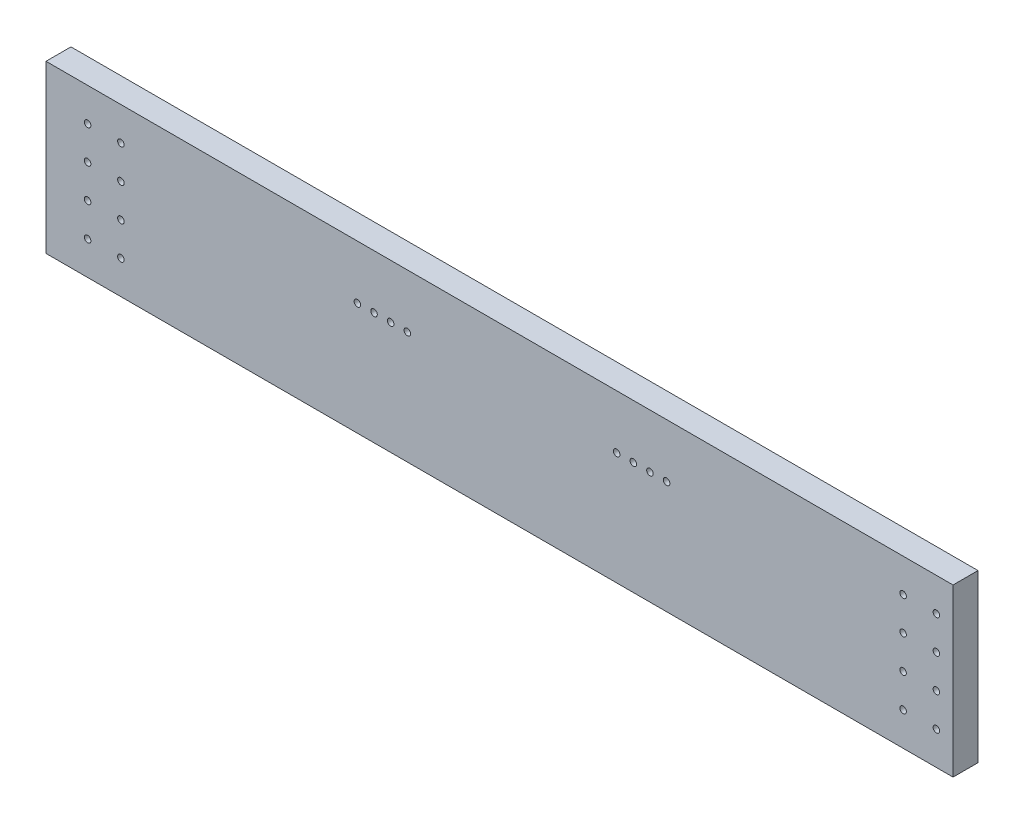
ISO-10303-21;
HEADER;
FILE_DESCRIPTION(('STEP AP214'),'2;1');
FILE_NAME('part.step','',(''),(''),'','','');
FILE_SCHEMA(('AUTOMOTIVE_DESIGN { 1 0 10303 214 1 1 1 1 }'));
ENDSEC;
DATA;
#1=APPLICATION_CONTEXT('core data for automotive mechanical design processes');
#2=APPLICATION_PROTOCOL_DEFINITION('international standard','automotive_design',2000,#1);
#3=PRODUCT_CONTEXT('',#1,'mechanical');
#4=PRODUCT('Part','Part','',(#3));
#5=PRODUCT_RELATED_PRODUCT_CATEGORY('part','',(#4));
#6=PRODUCT_DEFINITION_FORMATION('','',#4);
#7=PRODUCT_DEFINITION_CONTEXT('part definition',#1,'design');
#8=PRODUCT_DEFINITION('design','',#6,#7);
#9=PRODUCT_DEFINITION_SHAPE('','',#8);
#10=(LENGTH_UNIT() NAMED_UNIT(*) SI_UNIT(.MILLI.,.METRE.));
#11=(NAMED_UNIT(*) PLANE_ANGLE_UNIT() SI_UNIT($,.RADIAN.));
#12=(NAMED_UNIT(*) SI_UNIT($,.STERADIAN.) SOLID_ANGLE_UNIT());
#13=UNCERTAINTY_MEASURE_WITH_UNIT(LENGTH_MEASURE(1.E-05),#10,'distance_accuracy_value','');
#14=(GEOMETRIC_REPRESENTATION_CONTEXT(3) GLOBAL_UNCERTAINTY_ASSIGNED_CONTEXT((#13)) GLOBAL_UNIT_ASSIGNED_CONTEXT((#10,
#11,#12)) REPRESENTATION_CONTEXT('',''));
#15=CARTESIAN_POINT('',(0.,0.,0.));
#16=DIRECTION('',(0.,0.,1.));
#17=DIRECTION('',(1.,0.,0.));
#18=AXIS2_PLACEMENT_3D('',#15,#16,#17);
#19=CARTESIAN_POINT('',(31.75,38.1,6.35));
#20=DIRECTION('',(0.,0.,1.));
#21=DIRECTION('',(1.,0.,0.));
#22=AXIS2_PLACEMENT_3D('',#19,#20,#21);
#23=CYLINDRICAL_SURFACE('',#22,2.4892);
#24=CARTESIAN_POINT('',(31.75,38.1,6.35));
#25=DIRECTION('',(0.,0.,1.));
#26=DIRECTION('',(1.,0.,0.));
#27=AXIS2_PLACEMENT_3D('',#24,#25,#26);
#28=CIRCLE('',#27,2.4892);
#29=CARTESIAN_POINT('',(34.2392,38.1,6.35));
#30=VERTEX_POINT('',#29);
#31=EDGE_CURVE('E51',#30,#30,#28,.T.);
#32=ORIENTED_EDGE('',*,*,#31,.F.);
#33=EDGE_LOOP('',(#32));
#34=FACE_BOUND('',#33,.T.);
#35=CARTESIAN_POINT('',(31.75,38.1,25.4));
#36=DIRECTION('',(0.,0.,1.));
#37=DIRECTION('',(1.,0.,0.));
#38=AXIS2_PLACEMENT_3D('',#35,#36,#37);
#39=CIRCLE('',#38,2.4892);
#40=CARTESIAN_POINT('',(34.2392,38.1,25.4));
#41=VERTEX_POINT('',#40);
#42=EDGE_CURVE('E11',#41,#41,#39,.T.);
#43=ORIENTED_EDGE('',*,*,#42,.T.);
#44=EDGE_LOOP('',(#43));
#45=FACE_BOUND('',#44,.T.);
#46=ADVANCED_FACE('F42',(#34,#45),#23,.F.);
#47=CARTESIAN_POINT('',(31.75,12.7,6.35));
#48=DIRECTION('',(0.,0.,1.));
#49=DIRECTION('',(1.,0.,0.));
#50=AXIS2_PLACEMENT_3D('',#47,#48,#49);
#51=CYLINDRICAL_SURFACE('',#50,2.4892);
#52=CARTESIAN_POINT('',(31.75,12.7,6.35));
#53=DIRECTION('',(0.,0.,1.));
#54=DIRECTION('',(1.,0.,0.));
#55=AXIS2_PLACEMENT_3D('',#52,#53,#54);
#56=CIRCLE('',#55,2.4892);
#57=CARTESIAN_POINT('',(34.2392,12.7,6.35));
#58=VERTEX_POINT('',#57);
#59=EDGE_CURVE('E149',#58,#58,#56,.T.);
#60=ORIENTED_EDGE('',*,*,#59,.F.);
#61=EDGE_LOOP('',(#60));
#62=FACE_BOUND('',#61,.T.);
#63=CARTESIAN_POINT('',(31.75,12.7,25.4));
#64=DIRECTION('',(0.,0.,1.));
#65=DIRECTION('',(1.,0.,0.));
#66=AXIS2_PLACEMENT_3D('',#63,#64,#65);
#67=CIRCLE('',#66,2.4892);
#68=CARTESIAN_POINT('',(34.2392,12.7,25.4));
#69=VERTEX_POINT('',#68);
#70=EDGE_CURVE('E153',#69,#69,#67,.T.);
#71=ORIENTED_EDGE('',*,*,#70,.T.);
#72=EDGE_LOOP('',(#71));
#73=FACE_BOUND('',#72,.T.);
#74=ADVANCED_FACE('F165',(#62,#73),#51,.F.);
#75=CARTESIAN_POINT('',(6.35,38.1,6.35));
#76=DIRECTION('',(0.,0.,1.));
#77=DIRECTION('',(1.,0.,0.));
#78=AXIS2_PLACEMENT_3D('',#75,#76,#77);
#79=CYLINDRICAL_SURFACE('',#78,2.4892);
#80=CARTESIAN_POINT('',(6.35,38.1,6.35));
#81=DIRECTION('',(0.,0.,1.));
#82=DIRECTION('',(1.,0.,0.));
#83=AXIS2_PLACEMENT_3D('',#80,#81,#82);
#84=CIRCLE('',#83,2.4892);
#85=CARTESIAN_POINT('',(8.8392,38.1,6.35));
#86=VERTEX_POINT('',#85);
#87=EDGE_CURVE('E141',#86,#86,#84,.T.);
#88=ORIENTED_EDGE('',*,*,#87,.F.);
#89=EDGE_LOOP('',(#88));
#90=FACE_BOUND('',#89,.T.);
#91=CARTESIAN_POINT('',(6.35,38.1,25.4));
#92=DIRECTION('',(0.,0.,1.));
#93=DIRECTION('',(1.,0.,0.));
#94=AXIS2_PLACEMENT_3D('',#91,#92,#93);
#95=CIRCLE('',#94,2.4892);
#96=CARTESIAN_POINT('',(8.8392,38.1,25.4));
#97=VERTEX_POINT('',#96);
#98=EDGE_CURVE('E145',#97,#97,#95,.T.);
#99=ORIENTED_EDGE('',*,*,#98,.T.);
#100=EDGE_LOOP('',(#99));
#101=FACE_BOUND('',#100,.T.);
#102=ADVANCED_FACE('F186',(#90,#101),#79,.F.);
#103=CARTESIAN_POINT('',(6.35,12.7,6.35));
#104=DIRECTION('',(0.,0.,1.));
#105=DIRECTION('',(1.,0.,0.));
#106=AXIS2_PLACEMENT_3D('',#103,#104,#105);
#107=CYLINDRICAL_SURFACE('',#106,2.4892);
#108=CARTESIAN_POINT('',(6.35,12.7,6.35));
#109=DIRECTION('',(0.,0.,1.));
#110=DIRECTION('',(1.,0.,0.));
#111=AXIS2_PLACEMENT_3D('',#108,#109,#110);
#112=CIRCLE('',#111,2.4892);
#113=CARTESIAN_POINT('',(8.8392,12.7,6.35));
#114=VERTEX_POINT('',#113);
#115=EDGE_CURVE('E133',#114,#114,#112,.T.);
#116=ORIENTED_EDGE('',*,*,#115,.F.);
#117=EDGE_LOOP('',(#116));
#118=FACE_BOUND('',#117,.T.);
#119=CARTESIAN_POINT('',(6.35,12.7,25.4));
#120=DIRECTION('',(0.,0.,1.));
#121=DIRECTION('',(1.,0.,0.));
#122=AXIS2_PLACEMENT_3D('',#119,#120,#121);
#123=CIRCLE('',#122,2.4892);
#124=CARTESIAN_POINT('',(8.8392,12.7,25.4));
#125=VERTEX_POINT('',#124);
#126=EDGE_CURVE('E137',#125,#125,#123,.T.);
#127=ORIENTED_EDGE('',*,*,#126,.T.);
#128=EDGE_LOOP('',(#127));
#129=FACE_BOUND('',#128,.T.);
#130=ADVANCED_FACE('F177',(#118,#129),#107,.F.);
#131=CARTESIAN_POINT('',(-25.4,63.5,25.4));
#132=DIRECTION('',(1.,0.,0.));
#133=DIRECTION('',(0.,0.,-1.));
#134=AXIS2_PLACEMENT_3D('',#131,#132,#133);
#135=PLANE('',#134);
#136=DIRECTION('',(0.,0.,1.));
#137=VECTOR('',#136,1.);
#138=CARTESIAN_POINT('',(-25.4,-63.5,25.4));
#139=LINE('',#138,#137);
#140=CARTESIAN_POINT('',(-25.4,-63.5,6.35));
#141=VERTEX_POINT('',#140);
#142=CARTESIAN_POINT('',(-25.4,-63.5,25.4));
#143=VERTEX_POINT('',#142);
#144=EDGE_CURVE('E116',#141,#143,#139,.T.);
#145=ORIENTED_EDGE('',*,*,#144,.T.);
#146=DIRECTION('',(0.,-1.,0.));
#147=VECTOR('',#146,1.);
#148=CARTESIAN_POINT('',(-25.4,63.5,25.4));
#149=LINE('',#148,#147);
#150=CARTESIAN_POINT('',(-25.4,63.5,25.4));
#151=VERTEX_POINT('',#150);
#152=EDGE_CURVE('E104',#151,#143,#149,.T.);
#153=ORIENTED_EDGE('',*,*,#152,.F.);
#154=DIRECTION('',(0.,0.,1.));
#155=VECTOR('',#154,1.);
#156=CARTESIAN_POINT('',(-25.4,63.5,25.4));
#157=LINE('',#156,#155);
#158=CARTESIAN_POINT('',(-25.4,63.5,6.35));
#159=VERTEX_POINT('',#158);
#160=EDGE_CURVE('E95',#159,#151,#157,.T.);
#161=ORIENTED_EDGE('',*,*,#160,.F.);
#162=DIRECTION('',(0.,-1.,0.));
#163=VECTOR('',#162,1.);
#164=CARTESIAN_POINT('',(-25.4,63.5,6.35));
#165=LINE('',#164,#163);
#166=EDGE_CURVE('E112',#159,#141,#165,.T.);
#167=ORIENTED_EDGE('',*,*,#166,.T.);
#168=EDGE_LOOP('',(#145,#153,#161,#167));
#169=FACE_BOUND('',#168,.T.);
#170=ADVANCED_FACE('F169',(#169),#135,.F.);
#171=CARTESIAN_POINT('',(-25.4,63.5,25.4));
#172=DIRECTION('',(0.,0.,-1.));
#173=DIRECTION('',(-1.,0.,0.));
#174=AXIS2_PLACEMENT_3D('',#171,#172,#173);
#175=PLANE('',#174);
#176=CARTESIAN_POINT('',(448.183,22.479,25.4));
#177=DIRECTION('',(0.,0.,-1.));
#178=DIRECTION('',(-1.,0.,0.));
#179=AXIS2_PLACEMENT_3D('',#176,#177,#178);
#180=CIRCLE('',#179,2.4892);
#181=CARTESIAN_POINT('',(445.6938,22.479,25.4));
#182=VERTEX_POINT('',#181);
#183=EDGE_CURVE('E297',#182,#182,#180,.T.);
#184=ORIENTED_EDGE('',*,*,#183,.T.);
#185=EDGE_LOOP('',(#184));
#186=FACE_BOUND('',#185,.T.);
#187=CARTESIAN_POINT('',(435.483,22.479,25.4));
#188=DIRECTION('',(0.,0.,-1.));
#189=DIRECTION('',(-1.,0.,0.));
#190=AXIS2_PLACEMENT_3D('',#187,#188,#189);
#191=CIRCLE('',#190,2.4892);
#192=CARTESIAN_POINT('',(432.9938,22.479,25.4));
#193=VERTEX_POINT('',#192);
#194=EDGE_CURVE('E307',#193,#193,#191,.T.);
#195=ORIENTED_EDGE('',*,*,#194,.T.);
#196=EDGE_LOOP('',(#195));
#197=FACE_BOUND('',#196,.T.);
#198=CARTESIAN_POINT('',(422.783,22.479,25.4));
#199=DIRECTION('',(0.,0.,-1.));
#200=DIRECTION('',(-1.,0.,0.));
#201=AXIS2_PLACEMENT_3D('',#198,#199,#200);
#202=CIRCLE('',#201,2.4892);
#203=CARTESIAN_POINT('',(420.2938,22.479,25.4));
#204=VERTEX_POINT('',#203);
#205=EDGE_CURVE('E317',#204,#204,#202,.T.);
#206=ORIENTED_EDGE('',*,*,#205,.T.);
#207=EDGE_LOOP('',(#206));
#208=FACE_BOUND('',#207,.T.);
#209=CARTESIAN_POINT('',(410.083,22.479,25.4));
#210=DIRECTION('',(0.,0.,-1.));
#211=DIRECTION('',(-1.,0.,0.));
#212=AXIS2_PLACEMENT_3D('',#209,#210,#211);
#213=CIRCLE('',#212,2.48920000000001);
#214=CARTESIAN_POINT('',(407.5938,22.479,25.4));
#215=VERTEX_POINT('',#214);
#216=EDGE_CURVE('E325',#215,#215,#213,.T.);
#217=ORIENTED_EDGE('',*,*,#216,.T.);
#218=EDGE_LOOP('',(#217));
#219=FACE_BOUND('',#218,.T.);
#220=CARTESIAN_POINT('',(654.05,38.1,25.4));
#221=DIRECTION('',(0.,0.,-1.));
#222=DIRECTION('',(-1.,0.,0.));
#223=AXIS2_PLACEMENT_3D('',#220,#221,#222);
#224=CIRCLE('',#223,2.4892);
#225=CARTESIAN_POINT('',(651.5608,38.1,25.4));
#226=VERTEX_POINT('',#225);
#227=EDGE_CURVE('E333',#226,#226,#224,.T.);
#228=ORIENTED_EDGE('',*,*,#227,.T.);
#229=EDGE_LOOP('',(#228));
#230=FACE_BOUND('',#229,.T.);
#231=CARTESIAN_POINT('',(628.65,12.7,25.4));
#232=DIRECTION('',(0.,0.,-1.));
#233=DIRECTION('',(-1.,0.,0.));
#234=AXIS2_PLACEMENT_3D('',#231,#232,#233);
#235=CIRCLE('',#234,2.4892);
#236=CARTESIAN_POINT('',(626.1608,12.7,25.4));
#237=VERTEX_POINT('',#236);
#238=EDGE_CURVE('E342',#237,#237,#235,.T.);
#239=ORIENTED_EDGE('',*,*,#238,.T.);
#240=EDGE_LOOP('',(#239));
#241=FACE_BOUND('',#240,.T.);
#242=CARTESIAN_POINT('',(654.05,12.7,25.4));
#243=DIRECTION('',(0.,0.,-1.));
#244=DIRECTION('',(-1.,0.,0.));
#245=AXIS2_PLACEMENT_3D('',#242,#243,#244);
#246=CIRCLE('',#245,2.4892);
#247=CARTESIAN_POINT('',(651.5608,12.7,25.4));
#248=VERTEX_POINT('',#247);
#249=EDGE_CURVE('E341',#248,#248,#246,.T.);
#250=ORIENTED_EDGE('',*,*,#249,.T.);
#251=EDGE_LOOP('',(#250));
#252=FACE_BOUND('',#251,.T.);
#253=CARTESIAN_POINT('',(628.65,-12.7,25.4));
#254=DIRECTION('',(0.,0.,-1.));
#255=DIRECTION('',(-1.,0.,0.));
#256=AXIS2_PLACEMENT_3D('',#253,#254,#255);
#257=CIRCLE('',#256,2.4892);
#258=CARTESIAN_POINT('',(626.1608,-12.7,25.4));
#259=VERTEX_POINT('',#258);
#260=EDGE_CURVE('E358',#259,#259,#257,.T.);
#261=ORIENTED_EDGE('',*,*,#260,.T.);
#262=EDGE_LOOP('',(#261));
#263=FACE_BOUND('',#262,.T.);
#264=CARTESIAN_POINT('',(628.65,38.1,25.4));
#265=DIRECTION('',(0.,0.,-1.));
#266=DIRECTION('',(-1.,0.,0.));
#267=AXIS2_PLACEMENT_3D('',#264,#265,#266);
#268=CIRCLE('',#267,2.4892);
#269=CARTESIAN_POINT('',(626.1608,38.1,25.4));
#270=VERTEX_POINT('',#269);
#271=EDGE_CURVE('E304',#270,#270,#268,.T.);
#272=ORIENTED_EDGE('',*,*,#271,.T.);
#273=EDGE_LOOP('',(#272));
#274=FACE_BOUND('',#273,.T.);
#275=CARTESIAN_POINT('',(654.05,-12.7,25.4));
#276=DIRECTION('',(0.,0.,-1.));
#277=DIRECTION('',(-1.,0.,0.));
#278=AXIS2_PLACEMENT_3D('',#275,#276,#277);
#279=CIRCLE('',#278,2.4892);
#280=CARTESIAN_POINT('',(651.5608,-12.7,25.4));
#281=VERTEX_POINT('',#280);
#282=EDGE_CURVE('E357',#281,#281,#279,.T.);
#283=ORIENTED_EDGE('',*,*,#282,.T.);
#284=EDGE_LOOP('',(#283));
#285=FACE_BOUND('',#284,.T.);
#286=CARTESIAN_POINT('',(654.05,-38.1,25.4));
#287=DIRECTION('',(0.,0.,-1.));
#288=DIRECTION('',(-1.,0.,0.));
#289=AXIS2_PLACEMENT_3D('',#286,#287,#288);
#290=CIRCLE('',#289,2.4892);
#291=CARTESIAN_POINT('',(651.5608,-38.1,25.4));
#292=VERTEX_POINT('',#291);
#293=EDGE_CURVE('E382',#292,#292,#290,.T.);
#294=ORIENTED_EDGE('',*,*,#293,.T.);
#295=EDGE_LOOP('',(#294));
#296=FACE_BOUND('',#295,.T.);
#297=CARTESIAN_POINT('',(628.65,-38.1,25.4));
#298=DIRECTION('',(0.,0.,-1.));
#299=DIRECTION('',(-1.,0.,0.));
#300=AXIS2_PLACEMENT_3D('',#297,#298,#299);
#301=CIRCLE('',#300,2.4892);
#302=CARTESIAN_POINT('',(626.1608,-38.1,25.4));
#303=VERTEX_POINT('',#302);
#304=EDGE_CURVE('E373',#303,#303,#301,.T.);
#305=ORIENTED_EDGE('',*,*,#304,.T.);
#306=EDGE_LOOP('',(#305));
#307=FACE_BOUND('',#306,.T.);
#308=CARTESIAN_POINT('',(212.217,22.479,25.4));
#309=DIRECTION('',(0.,0.,1.));
#310=DIRECTION('',(1.,0.,0.));
#311=AXIS2_PLACEMENT_3D('',#308,#309,#310);
#312=CIRCLE('',#311,2.4892);
#313=CARTESIAN_POINT('',(214.7062,22.479,25.4));
#314=VERTEX_POINT('',#313);
#315=EDGE_CURVE('E398',#314,#314,#312,.T.);
#316=ORIENTED_EDGE('',*,*,#315,.F.);
#317=EDGE_LOOP('',(#316));
#318=FACE_BOUND('',#317,.T.);
#319=CARTESIAN_POINT('',(224.917,22.479,25.4));
#320=DIRECTION('',(0.,0.,1.));
#321=DIRECTION('',(1.,0.,0.));
#322=AXIS2_PLACEMENT_3D('',#319,#320,#321);
#323=CIRCLE('',#322,2.4892);
#324=CARTESIAN_POINT('',(227.4062,22.479,25.4));
#325=VERTEX_POINT('',#324);
#326=EDGE_CURVE('E402',#325,#325,#323,.T.);
#327=ORIENTED_EDGE('',*,*,#326,.F.);
#328=EDGE_LOOP('',(#327));
#329=FACE_BOUND('',#328,.T.);
#330=CARTESIAN_POINT('',(237.617,22.479,25.4));
#331=DIRECTION('',(0.,0.,1.));
#332=DIRECTION('',(1.,0.,0.));
#333=AXIS2_PLACEMENT_3D('',#330,#331,#332);
#334=CIRCLE('',#333,2.4892);
#335=CARTESIAN_POINT('',(240.1062,22.479,25.4));
#336=VERTEX_POINT('',#335);
#337=EDGE_CURVE('E410',#336,#336,#334,.T.);
#338=ORIENTED_EDGE('',*,*,#337,.F.);
#339=EDGE_LOOP('',(#338));
#340=FACE_BOUND('',#339,.T.);
#341=CARTESIAN_POINT('',(250.317,22.479,25.4));
#342=DIRECTION('',(0.,0.,1.));
#343=DIRECTION('',(1.,0.,0.));
#344=AXIS2_PLACEMENT_3D('',#341,#342,#343);
#345=CIRCLE('',#344,2.48920000000001);
#346=CARTESIAN_POINT('',(252.8062,22.479,25.4));
#347=VERTEX_POINT('',#346);
#348=EDGE_CURVE('E418',#347,#347,#345,.T.);
#349=ORIENTED_EDGE('',*,*,#348,.F.);
#350=EDGE_LOOP('',(#349));
#351=FACE_BOUND('',#350,.T.);
#352=CARTESIAN_POINT('',(31.75,-12.7,25.4));
#353=DIRECTION('',(0.,0.,1.));
#354=DIRECTION('',(1.,0.,0.));
#355=AXIS2_PLACEMENT_3D('',#352,#353,#354);
#356=CIRCLE('',#355,2.4892);
#357=CARTESIAN_POINT('',(34.2392,-12.7,25.4));
#358=VERTEX_POINT('',#357);
#359=EDGE_CURVE('E428',#358,#358,#356,.T.);
#360=ORIENTED_EDGE('',*,*,#359,.F.);
#361=EDGE_LOOP('',(#360));
#362=FACE_BOUND('',#361,.T.);
#363=CARTESIAN_POINT('',(6.35,-12.7,25.4));
#364=DIRECTION('',(0.,0.,1.));
#365=DIRECTION('',(1.,0.,0.));
#366=AXIS2_PLACEMENT_3D('',#363,#364,#365);
#367=CIRCLE('',#366,2.4892);
#368=CARTESIAN_POINT('',(8.8392,-12.7,25.4));
#369=VERTEX_POINT('',#368);
#370=EDGE_CURVE('E436',#369,#369,#367,.T.);
#371=ORIENTED_EDGE('',*,*,#370,.F.);
#372=EDGE_LOOP('',(#371));
#373=FACE_BOUND('',#372,.T.);
#374=CARTESIAN_POINT('',(6.35,-38.1,25.4));
#375=DIRECTION('',(0.,0.,1.));
#376=DIRECTION('',(1.,0.,0.));
#377=AXIS2_PLACEMENT_3D('',#374,#375,#376);
#378=CIRCLE('',#377,2.4892);
#379=CARTESIAN_POINT('',(8.8392,-38.1,25.4));
#380=VERTEX_POINT('',#379);
#381=EDGE_CURVE('E444',#380,#380,#378,.T.);
#382=ORIENTED_EDGE('',*,*,#381,.F.);
#383=EDGE_LOOP('',(#382));
#384=FACE_BOUND('',#383,.T.);
#385=CARTESIAN_POINT('',(31.75,-38.1,25.4));
#386=DIRECTION('',(0.,0.,1.));
#387=DIRECTION('',(1.,0.,0.));
#388=AXIS2_PLACEMENT_3D('',#385,#386,#387);
#389=CIRCLE('',#388,2.4892);
#390=CARTESIAN_POINT('',(34.2392,-38.1,25.4));
#391=VERTEX_POINT('',#390);
#392=EDGE_CURVE('E448',#391,#391,#389,.T.);
#393=ORIENTED_EDGE('',*,*,#392,.F.);
#394=EDGE_LOOP('',(#393));
#395=FACE_BOUND('',#394,.T.);
#396=DIRECTION('',(1.,0.,0.));
#397=VECTOR('',#396,1.);
#398=CARTESIAN_POINT('',(-25.4,-63.5,25.4));
#399=LINE('',#398,#397);
#400=CARTESIAN_POINT('',(666.75,-63.5,25.4));
#401=VERTEX_POINT('',#400);
#402=EDGE_CURVE('E102',#143,#401,#399,.T.);
#403=ORIENTED_EDGE('',*,*,#402,.T.);
#404=DIRECTION('',(0.,-1.,0.));
#405=VECTOR('',#404,1.);
#406=CARTESIAN_POINT('',(666.75,63.5,25.4));
#407=LINE('',#406,#405);
#408=CARTESIAN_POINT('',(666.75,63.5,25.4));
#409=VERTEX_POINT('',#408);
#410=EDGE_CURVE('E99',#409,#401,#407,.T.);
#411=ORIENTED_EDGE('',*,*,#410,.F.);
#412=DIRECTION('',(1.,0.,0.));
#413=VECTOR('',#412,1.);
#414=CARTESIAN_POINT('',(-25.4,63.5,25.4));
#415=LINE('',#414,#413);
#416=EDGE_CURVE('E90',#151,#409,#415,.T.);
#417=ORIENTED_EDGE('',*,*,#416,.F.);
#418=ORIENTED_EDGE('',*,*,#152,.T.);
#419=EDGE_LOOP('',(#403,#411,#417,#418));
#420=FACE_BOUND('',#419,.T.);
#421=ORIENTED_EDGE('',*,*,#126,.F.);
#422=EDGE_LOOP('',(#421));
#423=FACE_BOUND('',#422,.T.);
#424=ORIENTED_EDGE('',*,*,#98,.F.);
#425=EDGE_LOOP('',(#424));
#426=FACE_BOUND('',#425,.T.);
#427=ORIENTED_EDGE('',*,*,#70,.F.);
#428=EDGE_LOOP('',(#427));
#429=FACE_BOUND('',#428,.T.);
#430=ORIENTED_EDGE('',*,*,#42,.F.);
#431=EDGE_LOOP('',(#430));
#432=FACE_BOUND('',#431,.T.);
#433=ADVANCED_FACE('F100',(#186,#197,#208,#219,#230,#241,#252,#263,#274,#285,#296,#307,#318,
#329,#340,#351,#362,#373,#384,#395,#420,#423,#426,#429,#432),#175,.F.);
#434=CARTESIAN_POINT('',(666.75,63.5,25.4));
#435=DIRECTION('',(-1.,0.,0.));
#436=DIRECTION('',(0.,0.,1.));
#437=AXIS2_PLACEMENT_3D('',#434,#435,#436);
#438=PLANE('',#437);
#439=DIRECTION('',(0.,0.,-1.));
#440=VECTOR('',#439,1.);
#441=CARTESIAN_POINT('',(666.75,-63.5,25.4));
#442=LINE('',#441,#440);
#443=CARTESIAN_POINT('',(666.75,-63.5,6.35));
#444=VERTEX_POINT('',#443);
#445=EDGE_CURVE('E76',#401,#444,#442,.T.);
#446=ORIENTED_EDGE('',*,*,#445,.T.);
#447=DIRECTION('',(0.,-1.,0.));
#448=VECTOR('',#447,1.);
#449=CARTESIAN_POINT('',(666.75,63.5,6.35));
#450=LINE('',#449,#448);
#451=CARTESIAN_POINT('',(666.75,63.5,6.35));
#452=VERTEX_POINT('',#451);
#453=EDGE_CURVE('E105',#452,#444,#450,.T.);
#454=ORIENTED_EDGE('',*,*,#453,.F.);
#455=DIRECTION('',(0.,0.,-1.));
#456=VECTOR('',#455,1.);
#457=CARTESIAN_POINT('',(666.75,63.5,25.4));
#458=LINE('',#457,#456);
#459=EDGE_CURVE('E93',#409,#452,#458,.T.);
#460=ORIENTED_EDGE('',*,*,#459,.F.);
#461=ORIENTED_EDGE('',*,*,#410,.T.);
#462=EDGE_LOOP('',(#446,#454,#460,#461));
#463=FACE_BOUND('',#462,.T.);
#464=ADVANCED_FACE('F107',(#463),#438,.F.);
#465=CARTESIAN_POINT('',(-25.4,63.5,6.35));
#466=DIRECTION('',(0.,0.,1.));
#467=DIRECTION('',(1.,0.,0.));
#468=AXIS2_PLACEMENT_3D('',#465,#466,#467);
#469=PLANE('',#468);
#470=CARTESIAN_POINT('',(448.183,22.479,6.35));
#471=DIRECTION('',(0.,0.,-1.));
#472=DIRECTION('',(-1.,0.,0.));
#473=AXIS2_PLACEMENT_3D('',#470,#471,#472);
#474=CIRCLE('',#473,2.4892);
#475=CARTESIAN_POINT('',(445.6938,22.479,6.35));
#476=VERTEX_POINT('',#475);
#477=EDGE_CURVE('E295',#476,#476,#474,.T.);
#478=ORIENTED_EDGE('',*,*,#477,.F.);
#479=EDGE_LOOP('',(#478));
#480=FACE_BOUND('',#479,.T.);
#481=CARTESIAN_POINT('',(435.483,22.479,6.35));
#482=DIRECTION('',(0.,0.,-1.));
#483=DIRECTION('',(-1.,0.,0.));
#484=AXIS2_PLACEMENT_3D('',#481,#482,#483);
#485=CIRCLE('',#484,2.4892);
#486=CARTESIAN_POINT('',(432.9938,22.479,6.35));
#487=VERTEX_POINT('',#486);
#488=EDGE_CURVE('E299',#487,#487,#485,.T.);
#489=ORIENTED_EDGE('',*,*,#488,.F.);
#490=EDGE_LOOP('',(#489));
#491=FACE_BOUND('',#490,.T.);
#492=CARTESIAN_POINT('',(422.783,22.479,6.35));
#493=DIRECTION('',(0.,0.,-1.));
#494=DIRECTION('',(-1.,0.,0.));
#495=AXIS2_PLACEMENT_3D('',#492,#493,#494);
#496=CIRCLE('',#495,2.4892);
#497=CARTESIAN_POINT('',(420.2938,22.479,6.35));
#498=VERTEX_POINT('',#497);
#499=EDGE_CURVE('E313',#498,#498,#496,.T.);
#500=ORIENTED_EDGE('',*,*,#499,.F.);
#501=EDGE_LOOP('',(#500));
#502=FACE_BOUND('',#501,.T.);
#503=CARTESIAN_POINT('',(410.083,22.479,6.35));
#504=DIRECTION('',(0.,0.,-1.));
#505=DIRECTION('',(-1.,0.,0.));
#506=AXIS2_PLACEMENT_3D('',#503,#504,#505);
#507=CIRCLE('',#506,2.48920000000001);
#508=CARTESIAN_POINT('',(407.5938,22.479,6.35));
#509=VERTEX_POINT('',#508);
#510=EDGE_CURVE('E321',#509,#509,#507,.T.);
#511=ORIENTED_EDGE('',*,*,#510,.F.);
#512=EDGE_LOOP('',(#511));
#513=FACE_BOUND('',#512,.T.);
#514=CARTESIAN_POINT('',(654.05,38.1,6.35));
#515=DIRECTION('',(0.,0.,-1.));
#516=DIRECTION('',(-1.,0.,0.));
#517=AXIS2_PLACEMENT_3D('',#514,#515,#516);
#518=CIRCLE('',#517,2.4892);
#519=CARTESIAN_POINT('',(651.5608,38.1,6.35));
#520=VERTEX_POINT('',#519);
#521=EDGE_CURVE('E346',#520,#520,#518,.T.);
#522=ORIENTED_EDGE('',*,*,#521,.F.);
#523=EDGE_LOOP('',(#522));
#524=FACE_BOUND('',#523,.T.);
#525=CARTESIAN_POINT('',(628.65,12.7,6.35));
#526=DIRECTION('',(0.,0.,-1.));
#527=DIRECTION('',(-1.,0.,0.));
#528=AXIS2_PLACEMENT_3D('',#525,#526,#527);
#529=CIRCLE('',#528,2.4892);
#530=CARTESIAN_POINT('',(626.1608,12.7,6.35));
#531=VERTEX_POINT('',#530);
#532=EDGE_CURVE('E337',#531,#531,#529,.T.);
#533=ORIENTED_EDGE('',*,*,#532,.F.);
#534=EDGE_LOOP('',(#533));
#535=FACE_BOUND('',#534,.T.);
#536=CARTESIAN_POINT('',(654.05,12.7,6.35));
#537=DIRECTION('',(0.,0.,-1.));
#538=DIRECTION('',(-1.,0.,0.));
#539=AXIS2_PLACEMENT_3D('',#536,#537,#538);
#540=CIRCLE('',#539,2.4892);
#541=CARTESIAN_POINT('',(651.5608,12.7,6.35));
#542=VERTEX_POINT('',#541);
#543=EDGE_CURVE('E362',#542,#542,#540,.T.);
#544=ORIENTED_EDGE('',*,*,#543,.F.);
#545=EDGE_LOOP('',(#544));
#546=FACE_BOUND('',#545,.T.);
#547=CARTESIAN_POINT('',(628.65,-12.7,6.35));
#548=DIRECTION('',(0.,0.,-1.));
#549=DIRECTION('',(-1.,0.,0.));
#550=AXIS2_PLACEMENT_3D('',#547,#548,#549);
#551=CIRCLE('',#550,2.4892);
#552=CARTESIAN_POINT('',(626.1608,-12.7,6.35));
#553=VERTEX_POINT('',#552);
#554=EDGE_CURVE('E353',#553,#553,#551,.T.);
#555=ORIENTED_EDGE('',*,*,#554,.F.);
#556=EDGE_LOOP('',(#555));
#557=FACE_BOUND('',#556,.T.);
#558=CARTESIAN_POINT('',(628.65,38.1,6.35));
#559=DIRECTION('',(0.,0.,-1.));
#560=DIRECTION('',(-1.,0.,0.));
#561=AXIS2_PLACEMENT_3D('',#558,#559,#560);
#562=CIRCLE('',#561,2.4892);
#563=CARTESIAN_POINT('',(626.1608,38.1,6.35));
#564=VERTEX_POINT('',#563);
#565=EDGE_CURVE('E329',#564,#564,#562,.T.);
#566=ORIENTED_EDGE('',*,*,#565,.F.);
#567=EDGE_LOOP('',(#566));
#568=FACE_BOUND('',#567,.T.);
#569=CARTESIAN_POINT('',(654.05,-12.7,6.35));
#570=DIRECTION('',(0.,0.,-1.));
#571=DIRECTION('',(-1.,0.,0.));
#572=AXIS2_PLACEMENT_3D('',#569,#570,#571);
#573=CIRCLE('',#572,2.4892);
#574=CARTESIAN_POINT('',(651.5608,-12.7,6.35));
#575=VERTEX_POINT('',#574);
#576=EDGE_CURVE('E369',#575,#575,#573,.T.);
#577=ORIENTED_EDGE('',*,*,#576,.F.);
#578=EDGE_LOOP('',(#577));
#579=FACE_BOUND('',#578,.T.);
#580=CARTESIAN_POINT('',(654.05,-38.1,6.35));
#581=DIRECTION('',(0.,0.,-1.));
#582=DIRECTION('',(-1.,0.,0.));
#583=AXIS2_PLACEMENT_3D('',#580,#581,#582);
#584=CIRCLE('',#583,2.4892);
#585=CARTESIAN_POINT('',(651.5608,-38.1,6.35));
#586=VERTEX_POINT('',#585);
#587=EDGE_CURVE('E377',#586,#586,#584,.T.);
#588=ORIENTED_EDGE('',*,*,#587,.F.);
#589=EDGE_LOOP('',(#588));
#590=FACE_BOUND('',#589,.T.);
#591=CARTESIAN_POINT('',(628.65,-38.1,6.35));
#592=DIRECTION('',(0.,0.,-1.));
#593=DIRECTION('',(-1.,0.,0.));
#594=AXIS2_PLACEMENT_3D('',#591,#592,#593);
#595=CIRCLE('',#594,2.4892);
#596=CARTESIAN_POINT('',(626.1608,-38.1,6.35));
#597=VERTEX_POINT('',#596);
#598=EDGE_CURVE('E386',#597,#597,#595,.T.);
#599=ORIENTED_EDGE('',*,*,#598,.F.);
#600=EDGE_LOOP('',(#599));
#601=FACE_BOUND('',#600,.T.);
#602=CARTESIAN_POINT('',(212.217,22.479,6.35));
#603=DIRECTION('',(0.,0.,1.));
#604=DIRECTION('',(1.,0.,0.));
#605=AXIS2_PLACEMENT_3D('',#602,#603,#604);
#606=CIRCLE('',#605,2.4892);
#607=CARTESIAN_POINT('',(214.7062,22.479,6.35));
#608=VERTEX_POINT('',#607);
#609=EDGE_CURVE('E393',#608,#608,#606,.T.);
#610=ORIENTED_EDGE('',*,*,#609,.T.);
#611=EDGE_LOOP('',(#610));
#612=FACE_BOUND('',#611,.T.);
#613=CARTESIAN_POINT('',(224.917,22.479,6.35));
#614=DIRECTION('',(0.,0.,1.));
#615=DIRECTION('',(1.,0.,0.));
#616=AXIS2_PLACEMENT_3D('',#613,#614,#615);
#617=CIRCLE('',#616,2.4892);
#618=CARTESIAN_POINT('',(227.4062,22.479,6.35));
#619=VERTEX_POINT('',#618);
#620=EDGE_CURVE('E406',#619,#619,#617,.T.);
#621=ORIENTED_EDGE('',*,*,#620,.T.);
#622=EDGE_LOOP('',(#621));
#623=FACE_BOUND('',#622,.T.);
#624=CARTESIAN_POINT('',(237.617,22.479,6.35));
#625=DIRECTION('',(0.,0.,1.));
#626=DIRECTION('',(1.,0.,0.));
#627=AXIS2_PLACEMENT_3D('',#624,#625,#626);
#628=CIRCLE('',#627,2.4892);
#629=CARTESIAN_POINT('',(240.1062,22.479,6.35));
#630=VERTEX_POINT('',#629);
#631=EDGE_CURVE('E414',#630,#630,#628,.T.);
#632=ORIENTED_EDGE('',*,*,#631,.T.);
#633=EDGE_LOOP('',(#632));
#634=FACE_BOUND('',#633,.T.);
#635=CARTESIAN_POINT('',(250.317,22.479,6.35));
#636=DIRECTION('',(0.,0.,1.));
#637=DIRECTION('',(1.,0.,0.));
#638=AXIS2_PLACEMENT_3D('',#635,#636,#637);
#639=CIRCLE('',#638,2.48920000000001);
#640=CARTESIAN_POINT('',(252.8062,22.479,6.35));
#641=VERTEX_POINT('',#640);
#642=EDGE_CURVE('E381',#641,#641,#639,.T.);
#643=ORIENTED_EDGE('',*,*,#642,.T.);
#644=EDGE_LOOP('',(#643));
#645=FACE_BOUND('',#644,.T.);
#646=CARTESIAN_POINT('',(31.75,-12.7,6.35));
#647=DIRECTION('',(0.,0.,1.));
#648=DIRECTION('',(1.,0.,0.));
#649=AXIS2_PLACEMENT_3D('',#646,#647,#648);
#650=CIRCLE('',#649,2.4892);
#651=CARTESIAN_POINT('',(34.2392,-12.7,6.35));
#652=VERTEX_POINT('',#651);
#653=EDGE_CURVE('E397',#652,#652,#650,.T.);
#654=ORIENTED_EDGE('',*,*,#653,.T.);
#655=EDGE_LOOP('',(#654));
#656=FACE_BOUND('',#655,.T.);
#657=CARTESIAN_POINT('',(6.35,-12.7,6.35));
#658=DIRECTION('',(0.,0.,1.));
#659=DIRECTION('',(1.,0.,0.));
#660=AXIS2_PLACEMENT_3D('',#657,#658,#659);
#661=CIRCLE('',#660,2.4892);
#662=CARTESIAN_POINT('',(8.8392,-12.7,6.35));
#663=VERTEX_POINT('',#662);
#664=EDGE_CURVE('E432',#663,#663,#661,.T.);
#665=ORIENTED_EDGE('',*,*,#664,.T.);
#666=EDGE_LOOP('',(#665));
#667=FACE_BOUND('',#666,.T.);
#668=CARTESIAN_POINT('',(6.35,-38.1,6.35));
#669=DIRECTION('',(0.,0.,1.));
#670=DIRECTION('',(1.,0.,0.));
#671=AXIS2_PLACEMENT_3D('',#668,#669,#670);
#672=CIRCLE('',#671,2.4892);
#673=CARTESIAN_POINT('',(8.8392,-38.1,6.35));
#674=VERTEX_POINT('',#673);
#675=EDGE_CURVE('E120',#674,#674,#672,.T.);
#676=ORIENTED_EDGE('',*,*,#675,.T.);
#677=EDGE_LOOP('',(#676));
#678=FACE_BOUND('',#677,.T.);
#679=CARTESIAN_POINT('',(31.75,-38.1,6.35));
#680=DIRECTION('',(0.,0.,1.));
#681=DIRECTION('',(1.,0.,0.));
#682=AXIS2_PLACEMENT_3D('',#679,#680,#681);
#683=CIRCLE('',#682,2.4892);
#684=CARTESIAN_POINT('',(34.2392,-38.1,6.35));
#685=VERTEX_POINT('',#684);
#686=EDGE_CURVE('E440',#685,#685,#683,.T.);
#687=ORIENTED_EDGE('',*,*,#686,.T.);
#688=EDGE_LOOP('',(#687));
#689=FACE_BOUND('',#688,.T.);
#690=DIRECTION('',(-1.,0.,0.));
#691=VECTOR('',#690,1.);
#692=CARTESIAN_POINT('',(-25.4,-63.5,6.35));
#693=LINE('',#692,#691);
#694=EDGE_CURVE('E82',#444,#141,#693,.T.);
#695=ORIENTED_EDGE('',*,*,#694,.T.);
#696=ORIENTED_EDGE('',*,*,#166,.F.);
#697=DIRECTION('',(-1.,0.,0.));
#698=VECTOR('',#697,1.);
#699=CARTESIAN_POINT('',(-25.4,63.5,6.35));
#700=LINE('',#699,#698);
#701=EDGE_CURVE('E59',#452,#159,#700,.T.);
#702=ORIENTED_EDGE('',*,*,#701,.F.);
#703=ORIENTED_EDGE('',*,*,#453,.T.);
#704=EDGE_LOOP('',(#695,#696,#702,#703));
#705=FACE_BOUND('',#704,.T.);
#706=ORIENTED_EDGE('',*,*,#115,.T.);
#707=EDGE_LOOP('',(#706));
#708=FACE_BOUND('',#707,.T.);
#709=ORIENTED_EDGE('',*,*,#87,.T.);
#710=EDGE_LOOP('',(#709));
#711=FACE_BOUND('',#710,.T.);
#712=ORIENTED_EDGE('',*,*,#59,.T.);
#713=EDGE_LOOP('',(#712));
#714=FACE_BOUND('',#713,.T.);
#715=ORIENTED_EDGE('',*,*,#31,.T.);
#716=EDGE_LOOP('',(#715));
#717=FACE_BOUND('',#716,.T.);
#718=ADVANCED_FACE('F161',(#480,#491,#502,#513,#524,#535,#546,#557,#568,#579,#590,#601,#612,
#623,#634,#645,#656,#667,#678,#689,#705,#708,#711,#714,#717),#469,.F.);
#719=CARTESIAN_POINT('',(0.,63.5,0.));
#720=DIRECTION('',(0.,-1.,0.));
#721=DIRECTION('',(0.,0.,-1.));
#722=AXIS2_PLACEMENT_3D('',#719,#720,#721);
#723=PLANE('',#722);
#724=ORIENTED_EDGE('',*,*,#160,.T.);
#725=ORIENTED_EDGE('',*,*,#416,.T.);
#726=ORIENTED_EDGE('',*,*,#459,.T.);
#727=ORIENTED_EDGE('',*,*,#701,.T.);
#728=EDGE_LOOP('',(#724,#725,#726,#727));
#729=FACE_BOUND('',#728,.T.);
#730=ADVANCED_FACE('F91',(#729),#723,.F.);
#731=CARTESIAN_POINT('',(0.,-63.5,0.));
#732=DIRECTION('',(0.,-1.,0.));
#733=DIRECTION('',(0.,0.,-1.));
#734=AXIS2_PLACEMENT_3D('',#731,#732,#733);
#735=PLANE('',#734);
#736=ORIENTED_EDGE('',*,*,#144,.F.);
#737=ORIENTED_EDGE('',*,*,#694,.F.);
#738=ORIENTED_EDGE('',*,*,#445,.F.);
#739=ORIENTED_EDGE('',*,*,#402,.F.);
#740=EDGE_LOOP('',(#736,#737,#738,#739));
#741=FACE_BOUND('',#740,.T.);
#742=ADVANCED_FACE('F204',(#741),#735,.T.);
#743=CARTESIAN_POINT('',(31.75,-38.1,6.35));
#744=DIRECTION('',(0.,0.,1.));
#745=DIRECTION('',(1.,0.,0.));
#746=AXIS2_PLACEMENT_3D('',#743,#744,#745);
#747=CYLINDRICAL_SURFACE('',#746,2.4892);
#748=ORIENTED_EDGE('',*,*,#686,.F.);
#749=EDGE_LOOP('',(#748));
#750=FACE_BOUND('',#749,.T.);
#751=ORIENTED_EDGE('',*,*,#392,.T.);
#752=EDGE_LOOP('',(#751));
#753=FACE_BOUND('',#752,.T.);
#754=ADVANCED_FACE('F210',(#750,#753),#747,.F.);
#755=CARTESIAN_POINT('',(6.35,-38.1,6.35));
#756=DIRECTION('',(0.,0.,1.));
#757=DIRECTION('',(1.,0.,0.));
#758=AXIS2_PLACEMENT_3D('',#755,#756,#757);
#759=CYLINDRICAL_SURFACE('',#758,2.4892);
#760=ORIENTED_EDGE('',*,*,#675,.F.);
#761=EDGE_LOOP('',(#760));
#762=FACE_BOUND('',#761,.T.);
#763=ORIENTED_EDGE('',*,*,#381,.T.);
#764=EDGE_LOOP('',(#763));
#765=FACE_BOUND('',#764,.T.);
#766=ADVANCED_FACE('F215',(#762,#765),#759,.F.);
#767=CARTESIAN_POINT('',(6.35,-12.7,6.35));
#768=DIRECTION('',(0.,0.,1.));
#769=DIRECTION('',(1.,0.,0.));
#770=AXIS2_PLACEMENT_3D('',#767,#768,#769);
#771=CYLINDRICAL_SURFACE('',#770,2.4892);
#772=ORIENTED_EDGE('',*,*,#664,.F.);
#773=EDGE_LOOP('',(#772));
#774=FACE_BOUND('',#773,.T.);
#775=ORIENTED_EDGE('',*,*,#370,.T.);
#776=EDGE_LOOP('',(#775));
#777=FACE_BOUND('',#776,.T.);
#778=ADVANCED_FACE('F219',(#774,#777),#771,.F.);
#779=CARTESIAN_POINT('',(31.75,-12.7,6.35));
#780=DIRECTION('',(0.,0.,1.));
#781=DIRECTION('',(1.,0.,0.));
#782=AXIS2_PLACEMENT_3D('',#779,#780,#781);
#783=CYLINDRICAL_SURFACE('',#782,2.4892);
#784=ORIENTED_EDGE('',*,*,#653,.F.);
#785=EDGE_LOOP('',(#784));
#786=FACE_BOUND('',#785,.T.);
#787=ORIENTED_EDGE('',*,*,#359,.T.);
#788=EDGE_LOOP('',(#787));
#789=FACE_BOUND('',#788,.T.);
#790=ADVANCED_FACE('F223',(#786,#789),#783,.F.);
#791=CARTESIAN_POINT('',(250.317,22.479,6.35));
#792=DIRECTION('',(0.,0.,1.));
#793=DIRECTION('',(1.,0.,0.));
#794=AXIS2_PLACEMENT_3D('',#791,#792,#793);
#795=CYLINDRICAL_SURFACE('',#794,2.48920000000001);
#796=ORIENTED_EDGE('',*,*,#642,.F.);
#797=EDGE_LOOP('',(#796));
#798=FACE_BOUND('',#797,.T.);
#799=ORIENTED_EDGE('',*,*,#348,.T.);
#800=EDGE_LOOP('',(#799));
#801=FACE_BOUND('',#800,.T.);
#802=ADVANCED_FACE('F227',(#798,#801),#795,.F.);
#803=CARTESIAN_POINT('',(237.617,22.479,6.35));
#804=DIRECTION('',(0.,0.,1.));
#805=DIRECTION('',(1.,0.,0.));
#806=AXIS2_PLACEMENT_3D('',#803,#804,#805);
#807=CYLINDRICAL_SURFACE('',#806,2.4892);
#808=ORIENTED_EDGE('',*,*,#631,.F.);
#809=EDGE_LOOP('',(#808));
#810=FACE_BOUND('',#809,.T.);
#811=ORIENTED_EDGE('',*,*,#337,.T.);
#812=EDGE_LOOP('',(#811));
#813=FACE_BOUND('',#812,.T.);
#814=ADVANCED_FACE('F231',(#810,#813),#807,.F.);
#815=CARTESIAN_POINT('',(224.917,22.479,6.35));
#816=DIRECTION('',(0.,0.,1.));
#817=DIRECTION('',(1.,0.,0.));
#818=AXIS2_PLACEMENT_3D('',#815,#816,#817);
#819=CYLINDRICAL_SURFACE('',#818,2.4892);
#820=ORIENTED_EDGE('',*,*,#620,.F.);
#821=EDGE_LOOP('',(#820));
#822=FACE_BOUND('',#821,.T.);
#823=ORIENTED_EDGE('',*,*,#326,.T.);
#824=EDGE_LOOP('',(#823));
#825=FACE_BOUND('',#824,.T.);
#826=ADVANCED_FACE('F235',(#822,#825),#819,.F.);
#827=CARTESIAN_POINT('',(212.217,22.479,6.35));
#828=DIRECTION('',(0.,0.,1.));
#829=DIRECTION('',(1.,0.,0.));
#830=AXIS2_PLACEMENT_3D('',#827,#828,#829);
#831=CYLINDRICAL_SURFACE('',#830,2.4892);
#832=ORIENTED_EDGE('',*,*,#609,.F.);
#833=EDGE_LOOP('',(#832));
#834=FACE_BOUND('',#833,.T.);
#835=ORIENTED_EDGE('',*,*,#315,.T.);
#836=EDGE_LOOP('',(#835));
#837=FACE_BOUND('',#836,.T.);
#838=ADVANCED_FACE('F239',(#834,#837),#831,.F.);
#839=CARTESIAN_POINT('',(628.65,-38.1,6.35));
#840=DIRECTION('',(0.,0.,1.));
#841=DIRECTION('',(1.,0.,0.));
#842=AXIS2_PLACEMENT_3D('',#839,#840,#841);
#843=CYLINDRICAL_SURFACE('',#842,2.4892);
#844=ORIENTED_EDGE('',*,*,#598,.T.);
#845=EDGE_LOOP('',(#844));
#846=FACE_BOUND('',#845,.T.);
#847=ORIENTED_EDGE('',*,*,#304,.F.);
#848=EDGE_LOOP('',(#847));
#849=FACE_BOUND('',#848,.T.);
#850=ADVANCED_FACE('F243',(#846,#849),#843,.F.);
#851=CARTESIAN_POINT('',(654.05,-38.1,6.35));
#852=DIRECTION('',(0.,0.,1.));
#853=DIRECTION('',(1.,0.,0.));
#854=AXIS2_PLACEMENT_3D('',#851,#852,#853);
#855=CYLINDRICAL_SURFACE('',#854,2.4892);
#856=ORIENTED_EDGE('',*,*,#587,.T.);
#857=EDGE_LOOP('',(#856));
#858=FACE_BOUND('',#857,.T.);
#859=ORIENTED_EDGE('',*,*,#293,.F.);
#860=EDGE_LOOP('',(#859));
#861=FACE_BOUND('',#860,.T.);
#862=ADVANCED_FACE('F247',(#858,#861),#855,.F.);
#863=CARTESIAN_POINT('',(654.05,-12.7,6.35));
#864=DIRECTION('',(0.,0.,1.));
#865=DIRECTION('',(1.,0.,0.));
#866=AXIS2_PLACEMENT_3D('',#863,#864,#865);
#867=CYLINDRICAL_SURFACE('',#866,2.4892);
#868=ORIENTED_EDGE('',*,*,#576,.T.);
#869=EDGE_LOOP('',(#868));
#870=FACE_BOUND('',#869,.T.);
#871=ORIENTED_EDGE('',*,*,#282,.F.);
#872=EDGE_LOOP('',(#871));
#873=FACE_BOUND('',#872,.T.);
#874=ADVANCED_FACE('F251',(#870,#873),#867,.F.);
#875=CARTESIAN_POINT('',(628.65,38.1,6.35));
#876=DIRECTION('',(0.,0.,1.));
#877=DIRECTION('',(1.,0.,0.));
#878=AXIS2_PLACEMENT_3D('',#875,#876,#877);
#879=CYLINDRICAL_SURFACE('',#878,2.4892);
#880=ORIENTED_EDGE('',*,*,#565,.T.);
#881=EDGE_LOOP('',(#880));
#882=FACE_BOUND('',#881,.T.);
#883=ORIENTED_EDGE('',*,*,#271,.F.);
#884=EDGE_LOOP('',(#883));
#885=FACE_BOUND('',#884,.T.);
#886=ADVANCED_FACE('F255',(#882,#885),#879,.F.);
#887=CARTESIAN_POINT('',(628.65,-12.7,6.35));
#888=DIRECTION('',(0.,0.,1.));
#889=DIRECTION('',(1.,0.,0.));
#890=AXIS2_PLACEMENT_3D('',#887,#888,#889);
#891=CYLINDRICAL_SURFACE('',#890,2.4892);
#892=ORIENTED_EDGE('',*,*,#554,.T.);
#893=EDGE_LOOP('',(#892));
#894=FACE_BOUND('',#893,.T.);
#895=ORIENTED_EDGE('',*,*,#260,.F.);
#896=EDGE_LOOP('',(#895));
#897=FACE_BOUND('',#896,.T.);
#898=ADVANCED_FACE('F261',(#894,#897),#891,.F.);
#899=CARTESIAN_POINT('',(654.05,12.7,6.35));
#900=DIRECTION('',(0.,0.,1.));
#901=DIRECTION('',(1.,0.,0.));
#902=AXIS2_PLACEMENT_3D('',#899,#900,#901);
#903=CYLINDRICAL_SURFACE('',#902,2.4892);
#904=ORIENTED_EDGE('',*,*,#543,.T.);
#905=EDGE_LOOP('',(#904));
#906=FACE_BOUND('',#905,.T.);
#907=ORIENTED_EDGE('',*,*,#249,.F.);
#908=EDGE_LOOP('',(#907));
#909=FACE_BOUND('',#908,.T.);
#910=ADVANCED_FACE('F257',(#906,#909),#903,.F.);
#911=CARTESIAN_POINT('',(628.65,12.7,6.35));
#912=DIRECTION('',(0.,0.,1.));
#913=DIRECTION('',(1.,0.,0.));
#914=AXIS2_PLACEMENT_3D('',#911,#912,#913);
#915=CYLINDRICAL_SURFACE('',#914,2.4892);
#916=ORIENTED_EDGE('',*,*,#532,.T.);
#917=EDGE_LOOP('',(#916));
#918=FACE_BOUND('',#917,.T.);
#919=ORIENTED_EDGE('',*,*,#238,.F.);
#920=EDGE_LOOP('',(#919));
#921=FACE_BOUND('',#920,.T.);
#922=ADVANCED_FACE('F260',(#918,#921),#915,.F.);
#923=CARTESIAN_POINT('',(654.05,38.1,6.35));
#924=DIRECTION('',(0.,0.,1.));
#925=DIRECTION('',(1.,0.,0.));
#926=AXIS2_PLACEMENT_3D('',#923,#924,#925);
#927=CYLINDRICAL_SURFACE('',#926,2.4892);
#928=ORIENTED_EDGE('',*,*,#521,.T.);
#929=EDGE_LOOP('',(#928));
#930=FACE_BOUND('',#929,.T.);
#931=ORIENTED_EDGE('',*,*,#227,.F.);
#932=EDGE_LOOP('',(#931));
#933=FACE_BOUND('',#932,.T.);
#934=ADVANCED_FACE('F266',(#930,#933),#927,.F.);
#935=CARTESIAN_POINT('',(410.083,22.479,6.35));
#936=DIRECTION('',(0.,0.,1.));
#937=DIRECTION('',(1.,0.,0.));
#938=AXIS2_PLACEMENT_3D('',#935,#936,#937);
#939=CYLINDRICAL_SURFACE('',#938,2.48920000000001);
#940=ORIENTED_EDGE('',*,*,#510,.T.);
#941=EDGE_LOOP('',(#940));
#942=FACE_BOUND('',#941,.T.);
#943=ORIENTED_EDGE('',*,*,#216,.F.);
#944=EDGE_LOOP('',(#943));
#945=FACE_BOUND('',#944,.T.);
#946=ADVANCED_FACE('F269',(#942,#945),#939,.F.);
#947=CARTESIAN_POINT('',(422.783,22.479,6.35));
#948=DIRECTION('',(0.,0.,1.));
#949=DIRECTION('',(1.,0.,0.));
#950=AXIS2_PLACEMENT_3D('',#947,#948,#949);
#951=CYLINDRICAL_SURFACE('',#950,2.4892);
#952=ORIENTED_EDGE('',*,*,#499,.T.);
#953=EDGE_LOOP('',(#952));
#954=FACE_BOUND('',#953,.T.);
#955=ORIENTED_EDGE('',*,*,#205,.F.);
#956=EDGE_LOOP('',(#955));
#957=FACE_BOUND('',#956,.T.);
#958=ADVANCED_FACE('F279',(#954,#957),#951,.F.);
#959=CARTESIAN_POINT('',(435.483,22.479,6.35));
#960=DIRECTION('',(0.,0.,1.));
#961=DIRECTION('',(1.,0.,0.));
#962=AXIS2_PLACEMENT_3D('',#959,#960,#961);
#963=CYLINDRICAL_SURFACE('',#962,2.4892);
#964=ORIENTED_EDGE('',*,*,#488,.T.);
#965=EDGE_LOOP('',(#964));
#966=FACE_BOUND('',#965,.T.);
#967=ORIENTED_EDGE('',*,*,#194,.F.);
#968=EDGE_LOOP('',(#967));
#969=FACE_BOUND('',#968,.T.);
#970=ADVANCED_FACE('F283',(#966,#969),#963,.F.);
#971=CARTESIAN_POINT('',(448.183,22.479,6.35));
#972=DIRECTION('',(0.,0.,1.));
#973=DIRECTION('',(1.,0.,0.));
#974=AXIS2_PLACEMENT_3D('',#971,#972,#973);
#975=CYLINDRICAL_SURFACE('',#974,2.4892);
#976=ORIENTED_EDGE('',*,*,#477,.T.);
#977=EDGE_LOOP('',(#976));
#978=FACE_BOUND('',#977,.T.);
#979=ORIENTED_EDGE('',*,*,#183,.F.);
#980=EDGE_LOOP('',(#979));
#981=FACE_BOUND('',#980,.T.);
#982=ADVANCED_FACE('F287',(#978,#981),#975,.F.);
#983=CLOSED_SHELL('',(#46,#74,#102,#130,#170,#433,#464,#718,#730,#742,#754,#766,#778,#790,#802,
#814,#826,#838,#850,#862,#874,#886,#898,#910,#922,#934,#946,#958,#970,#982));
#984=MANIFOLD_SOLID_BREP('B2',#983);
#985=ADVANCED_BREP_SHAPE_REPRESENTATION('',(#18,#984),#14);
#986=SHAPE_DEFINITION_REPRESENTATION(#9,#985);
ENDSEC;
END-ISO-10303-21;
